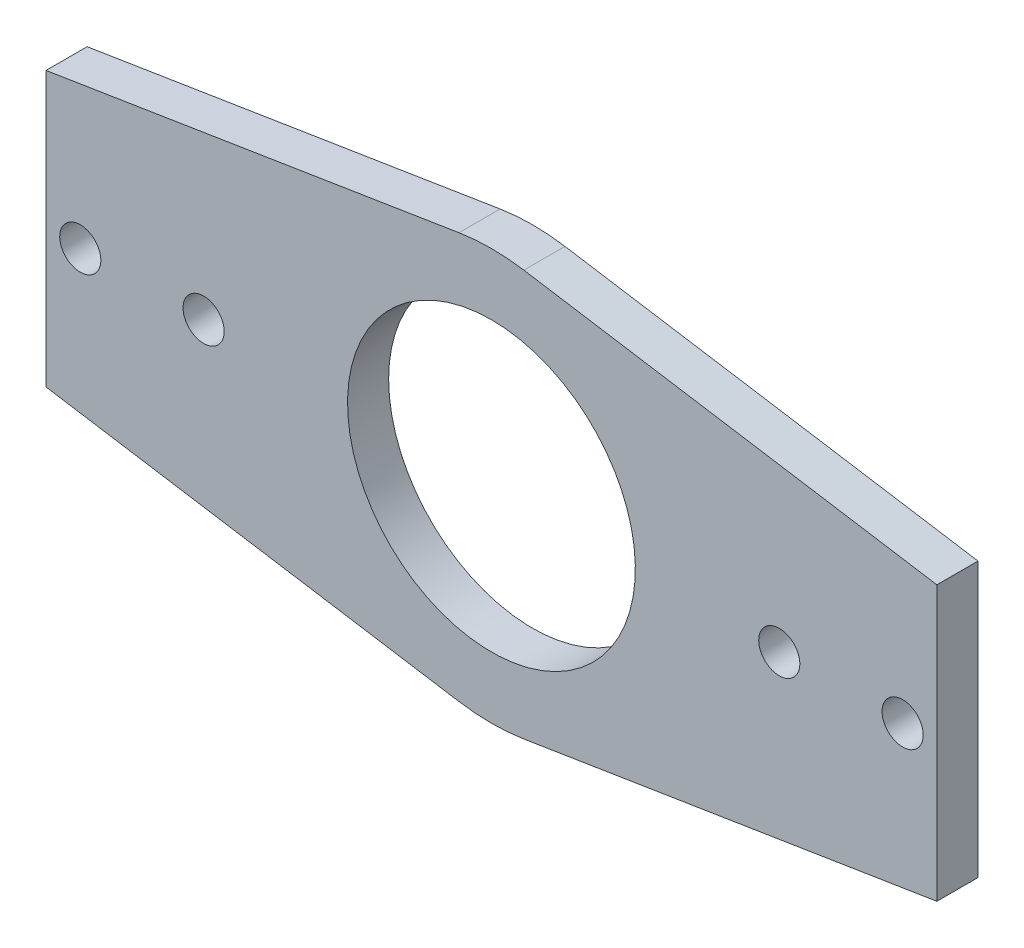
ISO-10303-21;
HEADER;
FILE_DESCRIPTION(('STEP AP214'),'2;1');
FILE_NAME('part.step','',(''),(''),'','','');
FILE_SCHEMA(('AUTOMOTIVE_DESIGN { 1 0 10303 214 1 1 1 1 }'));
ENDSEC;
DATA;
#1=APPLICATION_CONTEXT('core data for automotive mechanical design processes');
#2=APPLICATION_PROTOCOL_DEFINITION('international standard','automotive_design',2000,#1);
#3=PRODUCT_CONTEXT('',#1,'mechanical');
#4=PRODUCT('Part','Part','',(#3));
#5=PRODUCT_RELATED_PRODUCT_CATEGORY('part','',(#4));
#6=PRODUCT_DEFINITION_FORMATION('','',#4);
#7=PRODUCT_DEFINITION_CONTEXT('part definition',#1,'design');
#8=PRODUCT_DEFINITION('design','',#6,#7);
#9=PRODUCT_DEFINITION_SHAPE('','',#8);
#10=(LENGTH_UNIT() NAMED_UNIT(*) SI_UNIT(.MILLI.,.METRE.));
#11=(NAMED_UNIT(*) PLANE_ANGLE_UNIT() SI_UNIT($,.RADIAN.));
#12=(NAMED_UNIT(*) SI_UNIT($,.STERADIAN.) SOLID_ANGLE_UNIT());
#13=UNCERTAINTY_MEASURE_WITH_UNIT(LENGTH_MEASURE(1.E-05),#10,'distance_accuracy_value','');
#14=(GEOMETRIC_REPRESENTATION_CONTEXT(3) GLOBAL_UNCERTAINTY_ASSIGNED_CONTEXT((#13)) GLOBAL_UNIT_ASSIGNED_CONTEXT((#10,
#11,#12)) REPRESENTATION_CONTEXT('',''));
#15=CARTESIAN_POINT('',(0.,0.,0.));
#16=DIRECTION('',(0.,0.,1.));
#17=DIRECTION('',(1.,0.,0.));
#18=AXIS2_PLACEMENT_3D('',#15,#16,#17);
#19=CARTESIAN_POINT('',(0.,0.,6.));
#20=DIRECTION('',(0.,0.,-1.));
#21=DIRECTION('',(-1.,0.,0.));
#22=AXIS2_PLACEMENT_3D('',#19,#20,#21);
#23=CYLINDRICAL_SURFACE('',#22,30.);
#24=DIRECTION('',(0.,0.,-1.));
#25=VECTOR('',#24,1.);
#26=CARTESIAN_POINT('',(4.73088284384843,-29.6246307574927,6.));
#27=LINE('',#26,#25);
#28=CARTESIAN_POINT('',(4.73088284384843,-29.6246307574927,2.99999999999999));
#29=VERTEX_POINT('',#28);
#30=CARTESIAN_POINT('',(4.73088284384847,-29.6246307574927,-3.));
#31=VERTEX_POINT('',#30);
#32=EDGE_CURVE('E120',#29,#31,#27,.T.);
#33=ORIENTED_EDGE('',*,*,#32,.F.);
#34=CARTESIAN_POINT('',(0.,0.,3.));
#35=DIRECTION('',(0.,0.,-1.));
#36=DIRECTION('',(0.,1.,0.));
#37=AXIS2_PLACEMENT_3D('',#34,#35,#36);
#38=CIRCLE('',#37,30.);
#39=CARTESIAN_POINT('',(-4.73088284384841,-29.6246307574927,2.99999999999999));
#40=VERTEX_POINT('',#39);
#41=EDGE_CURVE('E101',#29,#40,#38,.T.);
#42=ORIENTED_EDGE('',*,*,#41,.T.);
#43=DIRECTION('',(0.,0.,-1.));
#44=VECTOR('',#43,1.);
#45=CARTESIAN_POINT('',(-4.73088284384841,-29.6246307574927,6.));
#46=LINE('',#45,#44);
#47=CARTESIAN_POINT('',(-4.7308828438484,-29.6246307574927,-3.));
#48=VERTEX_POINT('',#47);
#49=EDGE_CURVE('E122',#40,#48,#46,.T.);
#50=ORIENTED_EDGE('',*,*,#49,.T.);
#51=CARTESIAN_POINT('',(0.,0.,-3.));
#52=DIRECTION('',(0.,0.,-1.));
#53=DIRECTION('',(-1.,0.,0.));
#54=AXIS2_PLACEMENT_3D('',#51,#52,#53);
#55=CIRCLE('',#54,30.);
#56=EDGE_CURVE('E155',#31,#48,#55,.T.);
#57=ORIENTED_EDGE('',*,*,#56,.F.);
#58=EDGE_LOOP('',(#33,#42,#50,#57));
#59=FACE_BOUND('',#58,.T.);
#60=ADVANCED_FACE('F33',(#59),#23,.T.);
#61=CARTESIAN_POINT('',(-65.,20.,6.));
#62=DIRECTION('',(0.157696094794948,-0.987487691916422,0.));
#63=DIRECTION('',(0.987487691916422,0.157696094794948,0.));
#64=AXIS2_PLACEMENT_3D('',#61,#62,#63);
#65=PLANE('',#64);
#66=DIRECTION('',(0.,0.,-1.));
#67=VECTOR('',#66,1.);
#68=CARTESIAN_POINT('',(-65.,20.,6.));
#69=LINE('',#68,#67);
#70=CARTESIAN_POINT('',(-65.,20.,3.));
#71=VERTEX_POINT('',#70);
#72=CARTESIAN_POINT('',(-65.,20.,-3.));
#73=VERTEX_POINT('',#72);
#74=EDGE_CURVE('E42',#71,#73,#69,.T.);
#75=ORIENTED_EDGE('',*,*,#74,.F.);
#76=DIRECTION('',(0.987487691916422,0.157696094794948,0.));
#77=VECTOR('',#76,1.);
#78=CARTESIAN_POINT('',(-65.,20.,3.));
#79=LINE('',#78,#77);
#80=CARTESIAN_POINT('',(-4.73088284384842,29.6246307574927,3.));
#81=VERTEX_POINT('',#80);
#82=EDGE_CURVE('E184',#71,#81,#79,.T.);
#83=ORIENTED_EDGE('',*,*,#82,.T.);
#84=DIRECTION('',(0.,0.,-1.));
#85=VECTOR('',#84,1.);
#86=CARTESIAN_POINT('',(-4.73088284384843,29.6246307574927,6.));
#87=LINE('',#86,#85);
#88=CARTESIAN_POINT('',(-4.73088284384843,29.6246307574927,-3.));
#89=VERTEX_POINT('',#88);
#90=EDGE_CURVE('E11',#81,#89,#87,.T.);
#91=ORIENTED_EDGE('',*,*,#90,.T.);
#92=DIRECTION('',(0.987487691916422,0.157696094794947,0.));
#93=VECTOR('',#92,1.);
#94=CARTESIAN_POINT('',(-65.,20.,-3.));
#95=LINE('',#94,#93);
#96=EDGE_CURVE('E146',#73,#89,#95,.T.);
#97=ORIENTED_EDGE('',*,*,#96,.F.);
#98=EDGE_LOOP('',(#75,#83,#91,#97));
#99=FACE_BOUND('',#98,.T.);
#100=ADVANCED_FACE('F35',(#99),#65,.F.);
#101=CARTESIAN_POINT('',(-65.,20.,6.));
#102=DIRECTION('',(1.,0.,0.));
#103=DIRECTION('',(0.,1.,0.));
#104=AXIS2_PLACEMENT_3D('',#101,#102,#103);
#105=PLANE('',#104);
#106=DIRECTION('',(0.,0.,-1.));
#107=VECTOR('',#106,1.);
#108=CARTESIAN_POINT('',(-65.,-20.,6.));
#109=LINE('',#108,#107);
#110=CARTESIAN_POINT('',(-65.,-20.,2.99999999999999));
#111=VERTEX_POINT('',#110);
#112=CARTESIAN_POINT('',(-65.,-20.,-3.));
#113=VERTEX_POINT('',#112);
#114=EDGE_CURVE('E128',#111,#113,#109,.T.);
#115=ORIENTED_EDGE('',*,*,#114,.F.);
#116=DIRECTION('',(0.,1.,0.));
#117=VECTOR('',#116,1.);
#118=CARTESIAN_POINT('',(-65.,20.,3.));
#119=LINE('',#118,#117);
#120=EDGE_CURVE('E138',#111,#71,#119,.T.);
#121=ORIENTED_EDGE('',*,*,#120,.T.);
#122=ORIENTED_EDGE('',*,*,#74,.T.);
#123=DIRECTION('',(0.,1.,0.));
#124=VECTOR('',#123,1.);
#125=CARTESIAN_POINT('',(-65.,-20.,-3.));
#126=LINE('',#125,#124);
#127=EDGE_CURVE('E137',#113,#73,#126,.T.);
#128=ORIENTED_EDGE('',*,*,#127,.F.);
#129=EDGE_LOOP('',(#115,#121,#122,#128));
#130=FACE_BOUND('',#129,.T.);
#131=ADVANCED_FACE('F136',(#130),#105,.F.);
#132=CARTESIAN_POINT('',(-65.,-20.,6.));
#133=DIRECTION('',(0.157696094794947,0.987487691916422,0.));
#134=DIRECTION('',(-0.987487691916422,0.157696094794947,0.));
#135=AXIS2_PLACEMENT_3D('',#132,#133,#134);
#136=PLANE('',#135);
#137=ORIENTED_EDGE('',*,*,#49,.F.);
#138=DIRECTION('',(-0.987487691916422,0.157696094794947,0.));
#139=VECTOR('',#138,1.);
#140=CARTESIAN_POINT('',(-65.,-20.,2.99999999999999));
#141=LINE('',#140,#139);
#142=EDGE_CURVE('E180',#40,#111,#141,.T.);
#143=ORIENTED_EDGE('',*,*,#142,.T.);
#144=ORIENTED_EDGE('',*,*,#114,.T.);
#145=DIRECTION('',(-0.987487691916422,0.157696094794947,0.));
#146=VECTOR('',#145,1.);
#147=CARTESIAN_POINT('',(-4.7308828438484,-29.6246307574927,-3.));
#148=LINE('',#147,#146);
#149=EDGE_CURVE('E149',#48,#113,#148,.T.);
#150=ORIENTED_EDGE('',*,*,#149,.F.);
#151=EDGE_LOOP('',(#137,#143,#144,#150));
#152=FACE_BOUND('',#151,.T.);
#153=ADVANCED_FACE('F238',(#152),#136,.F.);
#154=ORIENTED_EDGE('',*,*,#90,.F.);
#155=CARTESIAN_POINT('',(0.,0.,3.));
#156=DIRECTION('',(0.,0.,-1.));
#157=DIRECTION('',(0.,1.,0.));
#158=AXIS2_PLACEMENT_3D('',#155,#156,#157);
#159=CIRCLE('',#158,30.);
#160=CARTESIAN_POINT('',(4.73088284384843,29.6246307574927,3.));
#161=VERTEX_POINT('',#160);
#162=EDGE_CURVE('E186',#81,#161,#159,.T.);
#163=ORIENTED_EDGE('',*,*,#162,.T.);
#164=DIRECTION('',(0.,0.,-1.));
#165=VECTOR('',#164,1.);
#166=CARTESIAN_POINT('',(4.73088284384843,29.6246307574927,6.));
#167=LINE('',#166,#165);
#168=CARTESIAN_POINT('',(4.73088284384843,29.6246307574927,-3.));
#169=VERTEX_POINT('',#168);
#170=EDGE_CURVE('E57',#161,#169,#167,.T.);
#171=ORIENTED_EDGE('',*,*,#170,.T.);
#172=CARTESIAN_POINT('',(0.,0.,-3.));
#173=DIRECTION('',(0.,0.,-1.));
#174=DIRECTION('',(-1.,0.,0.));
#175=AXIS2_PLACEMENT_3D('',#172,#173,#174);
#176=CIRCLE('',#175,30.);
#177=EDGE_CURVE('E163',#89,#169,#176,.T.);
#178=ORIENTED_EDGE('',*,*,#177,.F.);
#179=EDGE_LOOP('',(#154,#163,#171,#178));
#180=FACE_BOUND('',#179,.T.);
#181=ADVANCED_FACE('F231',(#180),#23,.T.);
#182=CARTESIAN_POINT('',(65.,-19.9999999999999,6.));
#183=DIRECTION('',(-0.157696094794948,0.987487691916422,0.));
#184=DIRECTION('',(-0.987487691916422,-0.157696094794948,0.));
#185=AXIS2_PLACEMENT_3D('',#182,#183,#184);
#186=PLANE('',#185);
#187=DIRECTION('',(0.,0.,-1.));
#188=VECTOR('',#187,1.);
#189=CARTESIAN_POINT('',(65.,-19.9999999999999,6.));
#190=LINE('',#189,#188);
#191=CARTESIAN_POINT('',(65.,-19.9999999999999,2.99999999999999));
#192=VERTEX_POINT('',#191);
#193=CARTESIAN_POINT('',(65.,-19.9999999999999,-3.));
#194=VERTEX_POINT('',#193);
#195=EDGE_CURVE('E111',#192,#194,#190,.T.);
#196=ORIENTED_EDGE('',*,*,#195,.F.);
#197=DIRECTION('',(-0.987487691916422,-0.157696094794948,0.));
#198=VECTOR('',#197,1.);
#199=CARTESIAN_POINT('',(65.,-19.9999999999999,2.99999999999999));
#200=LINE('',#199,#198);
#201=EDGE_CURVE('E98',#192,#29,#200,.T.);
#202=ORIENTED_EDGE('',*,*,#201,.T.);
#203=ORIENTED_EDGE('',*,*,#32,.T.);
#204=DIRECTION('',(-0.987487691916422,-0.157696094794949,0.));
#205=VECTOR('',#204,1.);
#206=CARTESIAN_POINT('',(65.,-19.9999999999999,-3.));
#207=LINE('',#206,#205);
#208=EDGE_CURVE('E119',#194,#31,#207,.T.);
#209=ORIENTED_EDGE('',*,*,#208,.F.);
#210=EDGE_LOOP('',(#196,#202,#203,#209));
#211=FACE_BOUND('',#210,.T.);
#212=ADVANCED_FACE('F117',(#211),#186,.F.);
#213=CARTESIAN_POINT('',(65.,20.,6.));
#214=DIRECTION('',(-1.,0.,0.));
#215=DIRECTION('',(0.,-1.,0.));
#216=AXIS2_PLACEMENT_3D('',#213,#214,#215);
#217=PLANE('',#216);
#218=DIRECTION('',(0.,0.,-1.));
#219=VECTOR('',#218,1.);
#220=CARTESIAN_POINT('',(65.,20.,6.));
#221=LINE('',#220,#219);
#222=CARTESIAN_POINT('',(65.,20.,2.99999999999999));
#223=VERTEX_POINT('',#222);
#224=CARTESIAN_POINT('',(65.,20.,-3.));
#225=VERTEX_POINT('',#224);
#226=EDGE_CURVE('E113',#223,#225,#221,.T.);
#227=ORIENTED_EDGE('',*,*,#226,.F.);
#228=DIRECTION('',(0.,1.,0.));
#229=VECTOR('',#228,1.);
#230=CARTESIAN_POINT('',(65.,36.6837941298991,3.));
#231=LINE('',#230,#229);
#232=EDGE_CURVE('E49',#192,#223,#231,.T.);
#233=ORIENTED_EDGE('',*,*,#232,.F.);
#234=ORIENTED_EDGE('',*,*,#195,.T.);
#235=DIRECTION('',(0.,-1.,0.));
#236=VECTOR('',#235,1.);
#237=CARTESIAN_POINT('',(65.,20.,-3.));
#238=LINE('',#237,#236);
#239=EDGE_CURVE('E158',#225,#194,#238,.T.);
#240=ORIENTED_EDGE('',*,*,#239,.F.);
#241=EDGE_LOOP('',(#227,#233,#234,#240));
#242=FACE_BOUND('',#241,.T.);
#243=ADVANCED_FACE('F109',(#242),#217,.F.);
#244=CARTESIAN_POINT('',(65.,20.,6.));
#245=DIRECTION('',(-0.157696094794948,-0.987487691916422,0.));
#246=DIRECTION('',(0.987487691916422,-0.157696094794948,0.));
#247=AXIS2_PLACEMENT_3D('',#244,#245,#246);
#248=PLANE('',#247);
#249=ORIENTED_EDGE('',*,*,#170,.F.);
#250=DIRECTION('',(0.987487691916422,-0.157696094794948,0.));
#251=VECTOR('',#250,1.);
#252=CARTESIAN_POINT('',(65.,20.,3.));
#253=LINE('',#252,#251);
#254=EDGE_CURVE('E188',#161,#223,#253,.T.);
#255=ORIENTED_EDGE('',*,*,#254,.T.);
#256=ORIENTED_EDGE('',*,*,#226,.T.);
#257=DIRECTION('',(0.987487691916422,-0.157696094794947,0.));
#258=VECTOR('',#257,1.);
#259=CARTESIAN_POINT('',(4.73088284384843,29.6246307574927,-3.));
#260=LINE('',#259,#258);
#261=EDGE_CURVE('E160',#169,#225,#260,.T.);
#262=ORIENTED_EDGE('',*,*,#261,.F.);
#263=EDGE_LOOP('',(#249,#255,#256,#262));
#264=FACE_BOUND('',#263,.T.);
#265=ADVANCED_FACE('F246',(#264),#248,.F.);
#266=CARTESIAN_POINT('',(59.9999999999841,-4.54497550705923E-13,6.));
#267=DIRECTION('',(0.,0.,-1.));
#268=DIRECTION('',(-1.,0.,0.));
#269=AXIS2_PLACEMENT_3D('',#266,#267,#268);
#270=CYLINDRICAL_SURFACE('',#269,3.00000000000002);
#271=CARTESIAN_POINT('',(59.9999999999841,-4.54497550705923E-13,3.));
#272=DIRECTION('',(0.,0.,-1.));
#273=DIRECTION('',(0.,1.,0.));
#274=AXIS2_PLACEMENT_3D('',#271,#272,#273);
#275=CIRCLE('',#274,3.00000000000002);
#276=CARTESIAN_POINT('',(59.9999999999841,2.99999999999956,3.));
#277=VERTEX_POINT('',#276);
#278=EDGE_CURVE('E190',#277,#277,#275,.T.);
#279=ORIENTED_EDGE('',*,*,#278,.F.);
#280=EDGE_LOOP('',(#279));
#281=FACE_BOUND('',#280,.T.);
#282=CARTESIAN_POINT('',(59.9999999999841,-4.54497550705923E-13,-3.));
#283=DIRECTION('',(0.,0.,-1.));
#284=DIRECTION('',(-1.,0.,0.));
#285=AXIS2_PLACEMENT_3D('',#282,#283,#284);
#286=CIRCLE('',#285,3.00000000000001);
#287=CARTESIAN_POINT('',(56.9999999999841,-4.54497550705923E-13,-3.));
#288=VERTEX_POINT('',#287);
#289=EDGE_CURVE('E105',#288,#288,#286,.T.);
#290=ORIENTED_EDGE('',*,*,#289,.T.);
#291=EDGE_LOOP('',(#290));
#292=FACE_BOUND('',#291,.T.);
#293=ADVANCED_FACE('F224',(#281,#292),#270,.F.);
#294=CARTESIAN_POINT('',(42.,0.,6.));
#295=DIRECTION('',(0.,0.,-1.));
#296=DIRECTION('',(-1.,0.,0.));
#297=AXIS2_PLACEMENT_3D('',#294,#295,#296);
#298=CYLINDRICAL_SURFACE('',#297,3.);
#299=CARTESIAN_POINT('',(42.,0.,3.));
#300=DIRECTION('',(0.,0.,-1.));
#301=DIRECTION('',(0.,1.,0.));
#302=AXIS2_PLACEMENT_3D('',#299,#300,#301);
#303=CIRCLE('',#302,3.);
#304=CARTESIAN_POINT('',(42.,3.,3.));
#305=VERTEX_POINT('',#304);
#306=EDGE_CURVE('E193',#305,#305,#303,.T.);
#307=ORIENTED_EDGE('',*,*,#306,.F.);
#308=EDGE_LOOP('',(#307));
#309=FACE_BOUND('',#308,.T.);
#310=CARTESIAN_POINT('',(42.,0.,-3.));
#311=DIRECTION('',(0.,0.,-1.));
#312=DIRECTION('',(-1.,0.,0.));
#313=AXIS2_PLACEMENT_3D('',#310,#311,#312);
#314=CIRCLE('',#313,3.);
#315=CARTESIAN_POINT('',(39.,0.,-3.));
#316=VERTEX_POINT('',#315);
#317=EDGE_CURVE('E174',#316,#316,#314,.T.);
#318=ORIENTED_EDGE('',*,*,#317,.T.);
#319=EDGE_LOOP('',(#318));
#320=FACE_BOUND('',#319,.T.);
#321=ADVANCED_FACE('F218',(#309,#320),#298,.F.);
#322=CARTESIAN_POINT('',(-59.9999999999841,-4.54497550705923E-13,6.));
#323=DIRECTION('',(0.,0.,-1.));
#324=DIRECTION('',(-1.,0.,0.));
#325=AXIS2_PLACEMENT_3D('',#322,#323,#324);
#326=CYLINDRICAL_SURFACE('',#325,3.00000000000001);
#327=CARTESIAN_POINT('',(-59.9999999999841,-4.54497550705923E-13,3.));
#328=DIRECTION('',(0.,0.,-1.));
#329=DIRECTION('',(0.,1.,0.));
#330=AXIS2_PLACEMENT_3D('',#327,#328,#329);
#331=CIRCLE('',#330,3.00000000000001);
#332=CARTESIAN_POINT('',(-59.9999999999841,2.99999999999955,3.));
#333=VERTEX_POINT('',#332);
#334=EDGE_CURVE('E196',#333,#333,#331,.T.);
#335=ORIENTED_EDGE('',*,*,#334,.F.);
#336=EDGE_LOOP('',(#335));
#337=FACE_BOUND('',#336,.T.);
#338=CARTESIAN_POINT('',(-59.9999999999841,-4.54497550705923E-13,-3.));
#339=DIRECTION('',(0.,0.,-1.));
#340=DIRECTION('',(-1.,0.,0.));
#341=AXIS2_PLACEMENT_3D('',#338,#339,#340);
#342=CIRCLE('',#341,3.00000000000002);
#343=CARTESIAN_POINT('',(-62.9999999999841,-4.54497550705923E-13,-3.));
#344=VERTEX_POINT('',#343);
#345=EDGE_CURVE('E165',#344,#344,#342,.T.);
#346=ORIENTED_EDGE('',*,*,#345,.T.);
#347=EDGE_LOOP('',(#346));
#348=FACE_BOUND('',#347,.T.);
#349=ADVANCED_FACE('F207',(#337,#348),#326,.F.);
#350=CARTESIAN_POINT('',(-42.,0.,6.));
#351=DIRECTION('',(0.,0.,-1.));
#352=DIRECTION('',(-1.,0.,0.));
#353=AXIS2_PLACEMENT_3D('',#350,#351,#352);
#354=CYLINDRICAL_SURFACE('',#353,3.);
#355=CARTESIAN_POINT('',(-42.,0.,3.));
#356=DIRECTION('',(0.,0.,-1.));
#357=DIRECTION('',(0.,1.,0.));
#358=AXIS2_PLACEMENT_3D('',#355,#356,#357);
#359=CIRCLE('',#358,3.);
#360=CARTESIAN_POINT('',(-42.,3.,3.));
#361=VERTEX_POINT('',#360);
#362=EDGE_CURVE('E114',#361,#361,#359,.T.);
#363=ORIENTED_EDGE('',*,*,#362,.F.);
#364=EDGE_LOOP('',(#363));
#365=FACE_BOUND('',#364,.T.);
#366=CARTESIAN_POINT('',(-42.,0.,-3.));
#367=DIRECTION('',(0.,0.,-1.));
#368=DIRECTION('',(-1.,0.,0.));
#369=AXIS2_PLACEMENT_3D('',#366,#367,#368);
#370=CIRCLE('',#369,3.);
#371=CARTESIAN_POINT('',(-45.,0.,-3.));
#372=VERTEX_POINT('',#371);
#373=EDGE_CURVE('E168',#372,#372,#370,.T.);
#374=ORIENTED_EDGE('',*,*,#373,.T.);
#375=EDGE_LOOP('',(#374));
#376=FACE_BOUND('',#375,.T.);
#377=ADVANCED_FACE('F203',(#365,#376),#354,.F.);
#378=CARTESIAN_POINT('',(0.,0.,-3.5));
#379=DIRECTION('',(0.,0.,1.));
#380=DIRECTION('',(1.,0.,0.));
#381=AXIS2_PLACEMENT_3D('',#378,#379,#380);
#382=CYLINDRICAL_SURFACE('',#381,21.);
#383=CARTESIAN_POINT('',(0.,0.,-3.));
#384=DIRECTION('',(0.,0.,-1.));
#385=DIRECTION('',(-1.,0.,0.));
#386=AXIS2_PLACEMENT_3D('',#383,#384,#385);
#387=CIRCLE('',#386,21.);
#388=CARTESIAN_POINT('',(-21.,0.,-3.));
#389=VERTEX_POINT('',#388);
#390=EDGE_CURVE('E171',#389,#389,#387,.T.);
#391=ORIENTED_EDGE('',*,*,#390,.T.);
#392=EDGE_LOOP('',(#391));
#393=FACE_BOUND('',#392,.T.);
#394=CARTESIAN_POINT('',(0.,0.,3.));
#395=DIRECTION('',(0.,0.,-1.));
#396=DIRECTION('',(0.,1.,0.));
#397=AXIS2_PLACEMENT_3D('',#394,#395,#396);
#398=CIRCLE('',#397,21.);
#399=CARTESIAN_POINT('',(0.,21.,3.));
#400=VERTEX_POINT('',#399);
#401=EDGE_CURVE('E37',#400,#400,#398,.T.);
#402=ORIENTED_EDGE('',*,*,#401,.F.);
#403=EDGE_LOOP('',(#402));
#404=FACE_BOUND('',#403,.T.);
#405=ADVANCED_FACE('F206',(#393,#404),#382,.F.);
#406=CARTESIAN_POINT('',(0.,0.,-3.));
#407=DIRECTION('',(0.,0.,-1.));
#408=DIRECTION('',(-1.,0.,0.));
#409=AXIS2_PLACEMENT_3D('',#406,#407,#408);
#410=PLANE('',#409);
#411=ORIENTED_EDGE('',*,*,#289,.F.);
#412=EDGE_LOOP('',(#411));
#413=FACE_BOUND('',#412,.T.);
#414=ORIENTED_EDGE('',*,*,#317,.F.);
#415=EDGE_LOOP('',(#414));
#416=FACE_BOUND('',#415,.T.);
#417=ORIENTED_EDGE('',*,*,#390,.F.);
#418=EDGE_LOOP('',(#417));
#419=FACE_BOUND('',#418,.T.);
#420=ORIENTED_EDGE('',*,*,#373,.F.);
#421=EDGE_LOOP('',(#420));
#422=FACE_BOUND('',#421,.T.);
#423=ORIENTED_EDGE('',*,*,#345,.F.);
#424=EDGE_LOOP('',(#423));
#425=FACE_BOUND('',#424,.T.);
#426=ORIENTED_EDGE('',*,*,#177,.T.);
#427=ORIENTED_EDGE('',*,*,#261,.T.);
#428=ORIENTED_EDGE('',*,*,#239,.T.);
#429=ORIENTED_EDGE('',*,*,#208,.T.);
#430=ORIENTED_EDGE('',*,*,#56,.T.);
#431=ORIENTED_EDGE('',*,*,#149,.T.);
#432=ORIENTED_EDGE('',*,*,#127,.T.);
#433=ORIENTED_EDGE('',*,*,#96,.T.);
#434=EDGE_LOOP('',(#426,#427,#428,#429,#430,#431,#432,#433));
#435=FACE_BOUND('',#434,.T.);
#436=ADVANCED_FACE('F145',(#413,#416,#419,#422,#425,#435),#410,.T.);
#437=CARTESIAN_POINT('',(-117.,36.6837941298991,3.));
#438=DIRECTION('',(0.,0.,-1.));
#439=DIRECTION('',(0.,1.,0.));
#440=AXIS2_PLACEMENT_3D('',#437,#438,#439);
#441=PLANE('',#440);
#442=ORIENTED_EDGE('',*,*,#401,.T.);
#443=EDGE_LOOP('',(#442));
#444=FACE_BOUND('',#443,.T.);
#445=ORIENTED_EDGE('',*,*,#278,.T.);
#446=EDGE_LOOP('',(#445));
#447=FACE_BOUND('',#446,.T.);
#448=ORIENTED_EDGE('',*,*,#306,.T.);
#449=EDGE_LOOP('',(#448));
#450=FACE_BOUND('',#449,.T.);
#451=ORIENTED_EDGE('',*,*,#334,.T.);
#452=EDGE_LOOP('',(#451));
#453=FACE_BOUND('',#452,.T.);
#454=ORIENTED_EDGE('',*,*,#362,.T.);
#455=EDGE_LOOP('',(#454));
#456=FACE_BOUND('',#455,.T.);
#457=ORIENTED_EDGE('',*,*,#232,.T.);
#458=ORIENTED_EDGE('',*,*,#254,.F.);
#459=ORIENTED_EDGE('',*,*,#162,.F.);
#460=ORIENTED_EDGE('',*,*,#82,.F.);
#461=ORIENTED_EDGE('',*,*,#120,.F.);
#462=ORIENTED_EDGE('',*,*,#142,.F.);
#463=ORIENTED_EDGE('',*,*,#41,.F.);
#464=ORIENTED_EDGE('',*,*,#201,.F.);
#465=EDGE_LOOP('',(#457,#458,#459,#460,#461,#462,#463,#464));
#466=FACE_BOUND('',#465,.T.);
#467=ADVANCED_FACE('F99',(#444,#447,#450,#453,#456,#466),#441,.F.);
#468=CLOSED_SHELL('',(#60,#100,#131,#153,#181,#212,#243,#265,#293,#321,#349,#377,#405,#436,#467));
#469=MANIFOLD_SOLID_BREP('B2',#468);
#470=ADVANCED_BREP_SHAPE_REPRESENTATION('',(#18,#469),#14);
#471=SHAPE_DEFINITION_REPRESENTATION(#9,#470);
ENDSEC;
END-ISO-10303-21;
